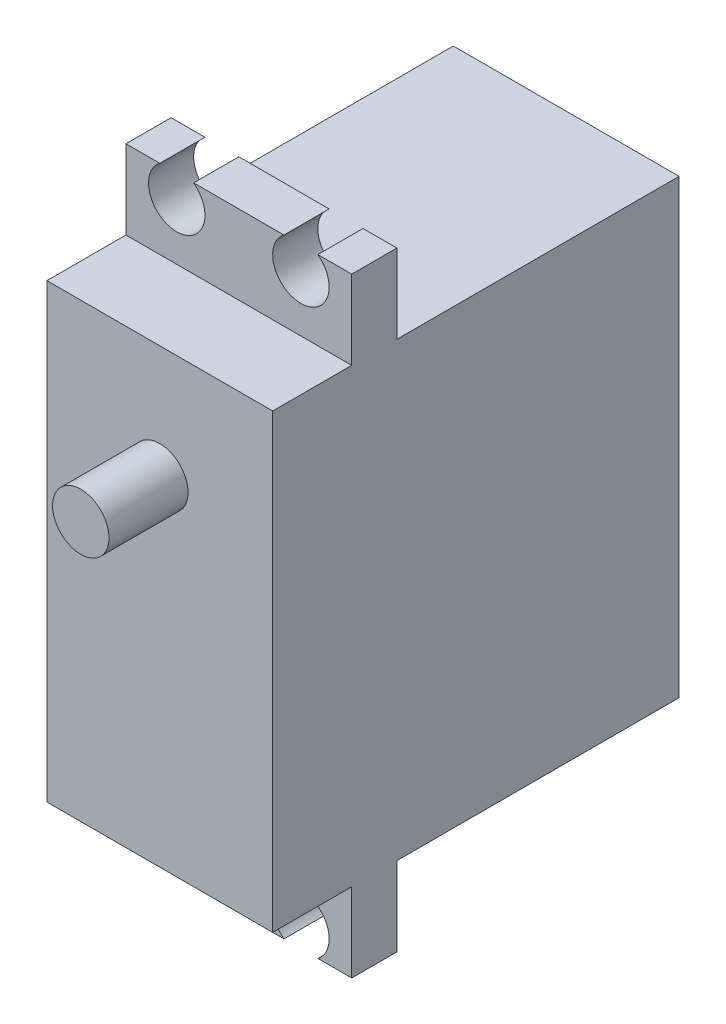
ISO-10303-21;
HEADER;
FILE_DESCRIPTION(('STEP AP214'),'2;1');
FILE_NAME('part.step','',(''),(''),'','','');
FILE_SCHEMA(('AUTOMOTIVE_DESIGN { 1 0 10303 214 1 1 1 1 }'));
ENDSEC;
DATA;
#1=APPLICATION_CONTEXT('core data for automotive mechanical design processes');
#2=APPLICATION_PROTOCOL_DEFINITION('international standard','automotive_design',2000,#1);
#3=PRODUCT_CONTEXT('',#1,'mechanical');
#4=PRODUCT('Part','Part','',(#3));
#5=PRODUCT_RELATED_PRODUCT_CATEGORY('part','',(#4));
#6=PRODUCT_DEFINITION_FORMATION('','',#4);
#7=PRODUCT_DEFINITION_CONTEXT('part definition',#1,'design');
#8=PRODUCT_DEFINITION('design','',#6,#7);
#9=PRODUCT_DEFINITION_SHAPE('','',#8);
#10=(LENGTH_UNIT() NAMED_UNIT(*) SI_UNIT(.MILLI.,.METRE.));
#11=(NAMED_UNIT(*) PLANE_ANGLE_UNIT() SI_UNIT($,.RADIAN.));
#12=(NAMED_UNIT(*) SI_UNIT($,.STERADIAN.) SOLID_ANGLE_UNIT());
#13=UNCERTAINTY_MEASURE_WITH_UNIT(LENGTH_MEASURE(1.E-05),#10,'distance_accuracy_value','');
#14=(GEOMETRIC_REPRESENTATION_CONTEXT(3) GLOBAL_UNCERTAINTY_ASSIGNED_CONTEXT((#13)) GLOBAL_UNIT_ASSIGNED_CONTEXT((#10,
#11,#12)) REPRESENTATION_CONTEXT('',''));
#15=CARTESIAN_POINT('',(0.,0.,0.));
#16=DIRECTION('',(0.,0.,1.));
#17=DIRECTION('',(1.,0.,0.));
#18=AXIS2_PLACEMENT_3D('',#15,#16,#17);
#19=CARTESIAN_POINT('',(0.,7.,25.));
#20=DIRECTION('',(0.,1.,0.));
#21=DIRECTION('',(0.,0.,1.));
#22=AXIS2_PLACEMENT_3D('',#19,#20,#21);
#23=PLANE('',#22);
#24=DIRECTION('',(0.,0.,1.));
#25=VECTOR('',#24,1.);
#26=CARTESIAN_POINT('',(14.,7.,22.));
#27=LINE('',#26,#25);
#28=CARTESIAN_POINT('',(14.,7.,25.));
#29=VERTEX_POINT('',#28);
#30=CARTESIAN_POINT('',(14.,7.,29.));
#31=VERTEX_POINT('',#30);
#32=EDGE_CURVE('E48',#29,#31,#27,.T.);
#33=ORIENTED_EDGE('',*,*,#32,.F.);
#34=DIRECTION('',(-1.,0.,0.));
#35=VECTOR('',#34,1.);
#36=CARTESIAN_POINT('',(0.,7.,25.));
#37=LINE('',#36,#35);
#38=CARTESIAN_POINT('',(6.,7.,25.));
#39=VERTEX_POINT('',#38);
#40=EDGE_CURVE('E237',#29,#39,#37,.T.);
#41=ORIENTED_EDGE('',*,*,#40,.T.);
#42=DIRECTION('',(0.,0.,1.));
#43=VECTOR('',#42,1.);
#44=CARTESIAN_POINT('',(6.,7.,22.));
#45=LINE('',#44,#43);
#46=CARTESIAN_POINT('',(6.,7.,29.));
#47=VERTEX_POINT('',#46);
#48=EDGE_CURVE('E227',#47,#39,#45,.F.);
#49=ORIENTED_EDGE('',*,*,#48,.F.);
#50=DIRECTION('',(-1.,0.,0.));
#51=VECTOR('',#50,1.);
#52=CARTESIAN_POINT('',(0.,7.,29.));
#53=LINE('',#52,#51);
#54=EDGE_CURVE('E190',#31,#47,#53,.T.);
#55=ORIENTED_EDGE('',*,*,#54,.F.);
#56=EDGE_LOOP('',(#33,#41,#49,#55));
#57=FACE_BOUND('',#56,.T.);
#58=ADVANCED_FACE('F34',(#57),#23,.T.);
#59=DIRECTION('',(0.,0.,1.));
#60=VECTOR('',#59,1.);
#61=CARTESIAN_POINT('',(3.,7.,22.));
#62=LINE('',#61,#60);
#63=CARTESIAN_POINT('',(3.,7.,25.));
#64=VERTEX_POINT('',#63);
#65=CARTESIAN_POINT('',(3.,7.,29.));
#66=VERTEX_POINT('',#65);
#67=EDGE_CURVE('E56',#64,#66,#62,.T.);
#68=ORIENTED_EDGE('',*,*,#67,.F.);
#69=CARTESIAN_POINT('',(0.,7.,25.));
#70=VERTEX_POINT('',#69);
#71=EDGE_CURVE('E241',#64,#70,#37,.T.);
#72=ORIENTED_EDGE('',*,*,#71,.T.);
#73=DIRECTION('',(0.,0.,1.));
#74=VECTOR('',#73,1.);
#75=CARTESIAN_POINT('',(0.,7.,25.));
#76=LINE('',#75,#74);
#77=CARTESIAN_POINT('',(0.,7.,29.));
#78=VERTEX_POINT('',#77);
#79=EDGE_CURVE('E249',#70,#78,#76,.T.);
#80=ORIENTED_EDGE('',*,*,#79,.T.);
#81=EDGE_CURVE('E192',#66,#78,#53,.T.);
#82=ORIENTED_EDGE('',*,*,#81,.F.);
#83=EDGE_LOOP('',(#68,#72,#80,#82));
#84=FACE_BOUND('',#83,.T.);
#85=ADVANCED_FACE('F407',(#84),#23,.T.);
#86=CARTESIAN_POINT('',(0.,-47.,25.));
#87=DIRECTION('',(0.,-1.,0.));
#88=DIRECTION('',(0.,0.,-1.));
#89=AXIS2_PLACEMENT_3D('',#86,#87,#88);
#90=PLANE('',#89);
#91=DIRECTION('',(0.,0.,1.));
#92=VECTOR('',#91,1.);
#93=CARTESIAN_POINT('',(17.,-47.,22.));
#94=LINE('',#93,#92);
#95=CARTESIAN_POINT('',(17.,-47.,25.));
#96=VERTEX_POINT('',#95);
#97=CARTESIAN_POINT('',(17.,-47.,29.));
#98=VERTEX_POINT('',#97);
#99=EDGE_CURVE('E219',#96,#98,#94,.T.);
#100=ORIENTED_EDGE('',*,*,#99,.F.);
#101=DIRECTION('',(1.,0.,0.));
#102=VECTOR('',#101,1.);
#103=CARTESIAN_POINT('',(0.,-47.,25.));
#104=LINE('',#103,#102);
#105=CARTESIAN_POINT('',(20.,-47.,25.));
#106=VERTEX_POINT('',#105);
#107=EDGE_CURVE('E336',#96,#106,#104,.T.);
#108=ORIENTED_EDGE('',*,*,#107,.T.);
#109=DIRECTION('',(0.,0.,1.));
#110=VECTOR('',#109,1.);
#111=CARTESIAN_POINT('',(20.,-47.,25.));
#112=LINE('',#111,#110);
#113=CARTESIAN_POINT('',(20.,-47.,29.));
#114=VERTEX_POINT('',#113);
#115=EDGE_CURVE('E292',#106,#114,#112,.T.);
#116=ORIENTED_EDGE('',*,*,#115,.T.);
#117=DIRECTION('',(1.,0.,0.));
#118=VECTOR('',#117,1.);
#119=CARTESIAN_POINT('',(0.,-47.,29.));
#120=LINE('',#119,#118);
#121=EDGE_CURVE('E356',#98,#114,#120,.T.);
#122=ORIENTED_EDGE('',*,*,#121,.F.);
#123=EDGE_LOOP('',(#100,#108,#116,#122));
#124=FACE_BOUND('',#123,.T.);
#125=ADVANCED_FACE('F378',(#124),#90,.T.);
#126=DIRECTION('',(0.,0.,1.));
#127=VECTOR('',#126,1.);
#128=CARTESIAN_POINT('',(14.,-47.,22.));
#129=LINE('',#128,#127);
#130=CARTESIAN_POINT('',(14.,-47.,29.));
#131=VERTEX_POINT('',#130);
#132=CARTESIAN_POINT('',(14.,-47.,25.));
#133=VERTEX_POINT('',#132);
#134=EDGE_CURVE('E221',#131,#133,#129,.F.);
#135=ORIENTED_EDGE('',*,*,#134,.F.);
#136=CARTESIAN_POINT('',(6.,-47.,29.));
#137=VERTEX_POINT('',#136);
#138=EDGE_CURVE('E355',#137,#131,#120,.T.);
#139=ORIENTED_EDGE('',*,*,#138,.F.);
#140=DIRECTION('',(0.,0.,1.));
#141=VECTOR('',#140,1.);
#142=CARTESIAN_POINT('',(6.,-47.,22.));
#143=LINE('',#142,#141);
#144=CARTESIAN_POINT('',(6.,-47.,25.));
#145=VERTEX_POINT('',#144);
#146=EDGE_CURVE('E210',#145,#137,#143,.T.);
#147=ORIENTED_EDGE('',*,*,#146,.F.);
#148=EDGE_CURVE('E335',#145,#133,#104,.T.);
#149=ORIENTED_EDGE('',*,*,#148,.T.);
#150=EDGE_LOOP('',(#135,#139,#147,#149));
#151=FACE_BOUND('',#150,.T.);
#152=ADVANCED_FACE('F388',(#151),#90,.T.);
#153=CARTESIAN_POINT('',(0.,-40.,36.));
#154=DIRECTION('',(0.,0.,1.));
#155=DIRECTION('',(1.,0.,0.));
#156=AXIS2_PLACEMENT_3D('',#153,#154,#155);
#157=PLANE('',#156);
#158=DIRECTION('',(1.,0.,0.));
#159=VECTOR('',#158,1.);
#160=CARTESIAN_POINT('',(0.,0.,36.));
#161=LINE('',#160,#159);
#162=CARTESIAN_POINT('',(0.,0.,36.));
#163=VERTEX_POINT('',#162);
#164=CARTESIAN_POINT('',(20.,0.,36.));
#165=VERTEX_POINT('',#164);
#166=EDGE_CURVE('E205',#163,#165,#161,.T.);
#167=ORIENTED_EDGE('',*,*,#166,.F.);
#168=DIRECTION('',(0.,-1.,0.));
#169=VECTOR('',#168,1.);
#170=CARTESIAN_POINT('',(0.,0.,36.));
#171=LINE('',#170,#169);
#172=CARTESIAN_POINT('',(0.,-40.,36.));
#173=VERTEX_POINT('',#172);
#174=EDGE_CURVE('E254',#163,#173,#171,.T.);
#175=ORIENTED_EDGE('',*,*,#174,.T.);
#176=DIRECTION('',(-1.,0.,0.));
#177=VECTOR('',#176,1.);
#178=CARTESIAN_POINT('',(0.,-40.,36.));
#179=LINE('',#178,#177);
#180=CARTESIAN_POINT('',(20.,-40.,36.));
#181=VERTEX_POINT('',#180);
#182=EDGE_CURVE('E347',#181,#173,#179,.T.);
#183=ORIENTED_EDGE('',*,*,#182,.F.);
#184=DIRECTION('',(0.,1.,0.));
#185=VECTOR('',#184,1.);
#186=CARTESIAN_POINT('',(20.,0.,36.));
#187=LINE('',#186,#185);
#188=EDGE_CURVE('E256',#181,#165,#187,.T.);
#189=ORIENTED_EDGE('',*,*,#188,.T.);
#190=EDGE_LOOP('',(#167,#175,#183,#189));
#191=FACE_BOUND('',#190,.T.);
#192=CARTESIAN_POINT('',(10.,-10.,36.));
#193=DIRECTION('',(0.,0.,1.));
#194=DIRECTION('',(1.,0.,0.));
#195=AXIS2_PLACEMENT_3D('',#192,#193,#194);
#196=CIRCLE('',#195,2.5);
#197=CARTESIAN_POINT('',(12.5,-10.,36.));
#198=VERTEX_POINT('',#197);
#199=EDGE_CURVE('E206',#198,#198,#196,.T.);
#200=ORIENTED_EDGE('',*,*,#199,.F.);
#201=EDGE_LOOP('',(#200));
#202=FACE_BOUND('',#201,.T.);
#203=ADVANCED_FACE('F369',(#191,#202),#157,.T.);
#204=DIRECTION('',(0.,0.,1.));
#205=VECTOR('',#204,1.);
#206=CARTESIAN_POINT('',(17.,7.,22.));
#207=LINE('',#206,#205);
#208=CARTESIAN_POINT('',(17.,7.,29.));
#209=VERTEX_POINT('',#208);
#210=CARTESIAN_POINT('',(17.,7.,25.));
#211=VERTEX_POINT('',#210);
#212=EDGE_CURVE('E170',#209,#211,#207,.F.);
#213=ORIENTED_EDGE('',*,*,#212,.F.);
#214=CARTESIAN_POINT('',(20.,7.,29.));
#215=VERTEX_POINT('',#214);
#216=EDGE_CURVE('E179',#215,#209,#53,.T.);
#217=ORIENTED_EDGE('',*,*,#216,.F.);
#218=DIRECTION('',(0.,0.,1.));
#219=VECTOR('',#218,1.);
#220=CARTESIAN_POINT('',(20.,7.,25.));
#221=LINE('',#220,#219);
#222=CARTESIAN_POINT('',(20.,7.,25.));
#223=VERTEX_POINT('',#222);
#224=EDGE_CURVE('E243',#223,#215,#221,.T.);
#225=ORIENTED_EDGE('',*,*,#224,.F.);
#226=EDGE_CURVE('E182',#223,#211,#37,.T.);
#227=ORIENTED_EDGE('',*,*,#226,.T.);
#228=EDGE_LOOP('',(#213,#217,#225,#227));
#229=FACE_BOUND('',#228,.T.);
#230=ADVANCED_FACE('F178',(#229),#23,.T.);
#231=CARTESIAN_POINT('',(0.,0.,36.));
#232=DIRECTION('',(1.,0.,0.));
#233=DIRECTION('',(0.,1.,0.));
#234=AXIS2_PLACEMENT_3D('',#231,#232,#233);
#235=PLANE('',#234);
#236=ORIENTED_EDGE('',*,*,#174,.F.);
#237=DIRECTION('',(0.,0.,1.));
#238=VECTOR('',#237,1.);
#239=CARTESIAN_POINT('',(0.,0.,29.));
#240=LINE('',#239,#238);
#241=CARTESIAN_POINT('',(0.,0.,29.));
#242=VERTEX_POINT('',#241);
#243=EDGE_CURVE('E189',#242,#163,#240,.T.);
#244=ORIENTED_EDGE('',*,*,#243,.F.);
#245=DIRECTION('',(0.,-1.,0.));
#246=VECTOR('',#245,1.);
#247=CARTESIAN_POINT('',(0.,7.,29.));
#248=LINE('',#247,#246);
#249=EDGE_CURVE('E201',#78,#242,#248,.T.);
#250=ORIENTED_EDGE('',*,*,#249,.F.);
#251=ORIENTED_EDGE('',*,*,#79,.F.);
#252=DIRECTION('',(0.,-1.,0.));
#253=VECTOR('',#252,1.);
#254=CARTESIAN_POINT('',(0.,0.,25.));
#255=LINE('',#254,#253);
#256=CARTESIAN_POINT('',(0.,0.,25.));
#257=VERTEX_POINT('',#256);
#258=EDGE_CURVE('E285',#70,#257,#255,.T.);
#259=ORIENTED_EDGE('',*,*,#258,.T.);
#260=DIRECTION('',(0.,0.,-1.));
#261=VECTOR('',#260,1.);
#262=CARTESIAN_POINT('',(0.,0.,36.));
#263=LINE('',#262,#261);
#264=CARTESIAN_POINT('',(0.,0.,0.));
#265=VERTEX_POINT('',#264);
#266=EDGE_CURVE('E260',#257,#265,#263,.T.);
#267=ORIENTED_EDGE('',*,*,#266,.T.);
#268=DIRECTION('',(0.,-1.,0.));
#269=VECTOR('',#268,1.);
#270=CARTESIAN_POINT('',(0.,0.,0.));
#271=LINE('',#270,#269);
#272=CARTESIAN_POINT('',(0.,-40.,0.));
#273=VERTEX_POINT('',#272);
#274=EDGE_CURVE('E252',#265,#273,#271,.T.);
#275=ORIENTED_EDGE('',*,*,#274,.T.);
#276=DIRECTION('',(0.,0.,-1.));
#277=VECTOR('',#276,1.);
#278=CARTESIAN_POINT('',(0.,-40.,36.));
#279=LINE('',#278,#277);
#280=CARTESIAN_POINT('',(0.,-40.,25.));
#281=VERTEX_POINT('',#280);
#282=EDGE_CURVE('E296',#281,#273,#279,.T.);
#283=ORIENTED_EDGE('',*,*,#282,.F.);
#284=DIRECTION('',(0.,-1.,0.));
#285=VECTOR('',#284,1.);
#286=CARTESIAN_POINT('',(0.,-40.,25.));
#287=LINE('',#286,#285);
#288=CARTESIAN_POINT('',(0.,-47.,25.));
#289=VERTEX_POINT('',#288);
#290=EDGE_CURVE('E306',#281,#289,#287,.T.);
#291=ORIENTED_EDGE('',*,*,#290,.T.);
#292=DIRECTION('',(0.,0.,1.));
#293=VECTOR('',#292,1.);
#294=CARTESIAN_POINT('',(0.,-47.,25.));
#295=LINE('',#294,#293);
#296=CARTESIAN_POINT('',(0.,-47.,29.));
#297=VERTEX_POINT('',#296);
#298=EDGE_CURVE('E304',#289,#297,#295,.T.);
#299=ORIENTED_EDGE('',*,*,#298,.T.);
#300=DIRECTION('',(0.,-1.,0.));
#301=VECTOR('',#300,1.);
#302=CARTESIAN_POINT('',(0.,-47.,29.));
#303=LINE('',#302,#301);
#304=CARTESIAN_POINT('',(0.,-40.,29.));
#305=VERTEX_POINT('',#304);
#306=EDGE_CURVE('E320',#305,#297,#303,.T.);
#307=ORIENTED_EDGE('',*,*,#306,.F.);
#308=DIRECTION('',(0.,0.,1.));
#309=VECTOR('',#308,1.);
#310=CARTESIAN_POINT('',(0.,-40.,29.));
#311=LINE('',#310,#309);
#312=EDGE_CURVE('E342',#305,#173,#311,.T.);
#313=ORIENTED_EDGE('',*,*,#312,.T.);
#314=EDGE_LOOP('',(#236,#244,#250,#251,#259,#267,#275,#283,#291,#299,#307,#313));
#315=FACE_BOUND('',#314,.T.);
#316=ADVANCED_FACE('F36',(#315),#235,.F.);
#317=CARTESIAN_POINT('',(0.,-40.,36.));
#318=DIRECTION('',(0.,1.,0.));
#319=DIRECTION('',(0.,0.,1.));
#320=AXIS2_PLACEMENT_3D('',#317,#318,#319);
#321=PLANE('',#320);
#322=DIRECTION('',(0.,0.,-1.));
#323=VECTOR('',#322,1.);
#324=CARTESIAN_POINT('',(20.,-40.,36.));
#325=LINE('',#324,#323);
#326=CARTESIAN_POINT('',(20.,-40.,25.));
#327=VERTEX_POINT('',#326);
#328=CARTESIAN_POINT('',(20.,-40.,0.));
#329=VERTEX_POINT('',#328);
#330=EDGE_CURVE('E281',#327,#329,#325,.T.);
#331=ORIENTED_EDGE('',*,*,#330,.F.);
#332=DIRECTION('',(-1.,0.,0.));
#333=VECTOR('',#332,1.);
#334=CARTESIAN_POINT('',(0.,-40.,25.));
#335=LINE('',#334,#333);
#336=EDGE_CURVE('E300',#327,#281,#335,.T.);
#337=ORIENTED_EDGE('',*,*,#336,.T.);
#338=ORIENTED_EDGE('',*,*,#282,.T.);
#339=DIRECTION('',(1.,0.,0.));
#340=VECTOR('',#339,1.);
#341=CARTESIAN_POINT('',(0.,-40.,0.));
#342=LINE('',#341,#340);
#343=EDGE_CURVE('E263',#273,#329,#342,.T.);
#344=ORIENTED_EDGE('',*,*,#343,.T.);
#345=EDGE_LOOP('',(#331,#337,#338,#344));
#346=FACE_BOUND('',#345,.T.);
#347=ADVANCED_FACE('F397',(#346),#321,.F.);
#348=CARTESIAN_POINT('',(20.,0.,36.));
#349=DIRECTION('',(-1.,0.,0.));
#350=DIRECTION('',(0.,-1.,0.));
#351=AXIS2_PLACEMENT_3D('',#348,#349,#350);
#352=PLANE('',#351);
#353=DIRECTION('',(0.,1.,0.));
#354=VECTOR('',#353,1.);
#355=CARTESIAN_POINT('',(20.,7.,29.));
#356=LINE('',#355,#354);
#357=CARTESIAN_POINT('',(20.,0.,29.));
#358=VERTEX_POINT('',#357);
#359=EDGE_CURVE('E188',#358,#215,#356,.T.);
#360=ORIENTED_EDGE('',*,*,#359,.F.);
#361=DIRECTION('',(0.,0.,1.));
#362=VECTOR('',#361,1.);
#363=CARTESIAN_POINT('',(20.,0.,29.));
#364=LINE('',#363,#362);
#365=EDGE_CURVE('E193',#358,#165,#364,.T.);
#366=ORIENTED_EDGE('',*,*,#365,.T.);
#367=ORIENTED_EDGE('',*,*,#188,.F.);
#368=DIRECTION('',(0.,0.,1.));
#369=VECTOR('',#368,1.);
#370=CARTESIAN_POINT('',(20.,-40.,29.));
#371=LINE('',#370,#369);
#372=CARTESIAN_POINT('',(20.,-40.,29.));
#373=VERTEX_POINT('',#372);
#374=EDGE_CURVE('E343',#373,#181,#371,.T.);
#375=ORIENTED_EDGE('',*,*,#374,.F.);
#376=DIRECTION('',(0.,1.,0.));
#377=VECTOR('',#376,1.);
#378=CARTESIAN_POINT('',(20.,-47.,29.));
#379=LINE('',#378,#377);
#380=EDGE_CURVE('E352',#114,#373,#379,.T.);
#381=ORIENTED_EDGE('',*,*,#380,.F.);
#382=ORIENTED_EDGE('',*,*,#115,.F.);
#383=DIRECTION('',(0.,1.,0.));
#384=VECTOR('',#383,1.);
#385=CARTESIAN_POINT('',(20.,-40.,25.));
#386=LINE('',#385,#384);
#387=EDGE_CURVE('E305',#106,#327,#386,.T.);
#388=ORIENTED_EDGE('',*,*,#387,.T.);
#389=ORIENTED_EDGE('',*,*,#330,.T.);
#390=DIRECTION('',(0.,1.,0.));
#391=VECTOR('',#390,1.);
#392=CARTESIAN_POINT('',(20.,0.,0.));
#393=LINE('',#392,#391);
#394=CARTESIAN_POINT('',(20.,0.,0.));
#395=VERTEX_POINT('',#394);
#396=EDGE_CURVE('E266',#329,#395,#393,.T.);
#397=ORIENTED_EDGE('',*,*,#396,.T.);
#398=DIRECTION('',(0.,0.,-1.));
#399=VECTOR('',#398,1.);
#400=CARTESIAN_POINT('',(20.,0.,36.));
#401=LINE('',#400,#399);
#402=CARTESIAN_POINT('',(20.,0.,25.));
#403=VERTEX_POINT('',#402);
#404=EDGE_CURVE('E278',#403,#395,#401,.T.);
#405=ORIENTED_EDGE('',*,*,#404,.F.);
#406=DIRECTION('',(0.,1.,0.));
#407=VECTOR('',#406,1.);
#408=CARTESIAN_POINT('',(20.,0.,25.));
#409=LINE('',#408,#407);
#410=EDGE_CURVE('E244',#403,#223,#409,.T.);
#411=ORIENTED_EDGE('',*,*,#410,.T.);
#412=ORIENTED_EDGE('',*,*,#224,.T.);
#413=EDGE_LOOP('',(#360,#366,#367,#375,#381,#382,#388,#389,#397,#405,#411,#412));
#414=FACE_BOUND('',#413,.T.);
#415=ADVANCED_FACE('F366',(#414),#352,.F.);
#416=CARTESIAN_POINT('',(0.,0.,36.));
#417=DIRECTION('',(0.,-1.,0.));
#418=DIRECTION('',(0.,0.,-1.));
#419=AXIS2_PLACEMENT_3D('',#416,#417,#418);
#420=PLANE('',#419);
#421=ORIENTED_EDGE('',*,*,#266,.F.);
#422=DIRECTION('',(1.,0.,0.));
#423=VECTOR('',#422,1.);
#424=CARTESIAN_POINT('',(0.,0.,25.));
#425=LINE('',#424,#423);
#426=EDGE_CURVE('E282',#257,#403,#425,.T.);
#427=ORIENTED_EDGE('',*,*,#426,.T.);
#428=ORIENTED_EDGE('',*,*,#404,.T.);
#429=DIRECTION('',(-1.,0.,0.));
#430=VECTOR('',#429,1.);
#431=CARTESIAN_POINT('',(0.,0.,0.));
#432=LINE('',#431,#430);
#433=EDGE_CURVE('E257',#395,#265,#432,.T.);
#434=ORIENTED_EDGE('',*,*,#433,.T.);
#435=EDGE_LOOP('',(#421,#427,#428,#434));
#436=FACE_BOUND('',#435,.T.);
#437=ADVANCED_FACE('F403',(#436),#420,.F.);
#438=CARTESIAN_POINT('',(0.,-40.,0.));
#439=DIRECTION('',(0.,0.,1.));
#440=DIRECTION('',(1.,0.,0.));
#441=AXIS2_PLACEMENT_3D('',#438,#439,#440);
#442=PLANE('',#441);
#443=ORIENTED_EDGE('',*,*,#274,.F.);
#444=ORIENTED_EDGE('',*,*,#433,.F.);
#445=ORIENTED_EDGE('',*,*,#396,.F.);
#446=ORIENTED_EDGE('',*,*,#343,.F.);
#447=EDGE_LOOP('',(#443,#444,#445,#446));
#448=FACE_BOUND('',#447,.T.);
#449=ADVANCED_FACE('F400',(#448),#442,.F.);
#450=CARTESIAN_POINT('',(0.,0.,25.));
#451=DIRECTION('',(0.,0.,-1.));
#452=DIRECTION('',(-1.,0.,0.));
#453=AXIS2_PLACEMENT_3D('',#450,#451,#452);
#454=PLANE('',#453);
#455=CARTESIAN_POINT('',(15.5,5.,25.));
#456=DIRECTION('',(0.,0.,-1.));
#457=DIRECTION('',(-1.,0.,0.));
#458=AXIS2_PLACEMENT_3D('',#455,#456,#457);
#459=CIRCLE('',#458,2.5);
#460=EDGE_CURVE('E183',#211,#29,#459,.T.);
#461=ORIENTED_EDGE('',*,*,#460,.F.);
#462=ORIENTED_EDGE('',*,*,#226,.F.);
#463=ORIENTED_EDGE('',*,*,#410,.F.);
#464=ORIENTED_EDGE('',*,*,#426,.F.);
#465=ORIENTED_EDGE('',*,*,#258,.F.);
#466=ORIENTED_EDGE('',*,*,#71,.F.);
#467=CARTESIAN_POINT('',(4.5,5.,25.));
#468=DIRECTION('',(0.,0.,-1.));
#469=DIRECTION('',(-1.,0.,0.));
#470=AXIS2_PLACEMENT_3D('',#467,#468,#469);
#471=CIRCLE('',#470,2.5);
#472=EDGE_CURVE('E230',#39,#64,#471,.T.);
#473=ORIENTED_EDGE('',*,*,#472,.F.);
#474=ORIENTED_EDGE('',*,*,#40,.F.);
#475=EDGE_LOOP('',(#461,#462,#463,#464,#465,#466,#473,#474));
#476=FACE_BOUND('',#475,.T.);
#477=ADVANCED_FACE('F239',(#476),#454,.T.);
#478=DIRECTION('',(0.,0.,1.));
#479=VECTOR('',#478,1.);
#480=CARTESIAN_POINT('',(3.,-47.,22.));
#481=LINE('',#480,#479);
#482=CARTESIAN_POINT('',(3.,-47.,29.));
#483=VERTEX_POINT('',#482);
#484=CARTESIAN_POINT('',(3.,-47.,25.));
#485=VERTEX_POINT('',#484);
#486=EDGE_CURVE('E214',#483,#485,#481,.F.);
#487=ORIENTED_EDGE('',*,*,#486,.F.);
#488=EDGE_CURVE('E329',#297,#483,#120,.T.);
#489=ORIENTED_EDGE('',*,*,#488,.F.);
#490=ORIENTED_EDGE('',*,*,#298,.F.);
#491=EDGE_CURVE('E311',#289,#485,#104,.T.);
#492=ORIENTED_EDGE('',*,*,#491,.T.);
#493=EDGE_LOOP('',(#487,#489,#490,#492));
#494=FACE_BOUND('',#493,.T.);
#495=ADVANCED_FACE('F327',(#494),#90,.T.);
#496=CARTESIAN_POINT('',(0.,0.,25.));
#497=DIRECTION('',(0.,0.,1.));
#498=DIRECTION('',(1.,0.,0.));
#499=AXIS2_PLACEMENT_3D('',#496,#497,#498);
#500=PLANE('',#499);
#501=ORIENTED_EDGE('',*,*,#107,.F.);
#502=CARTESIAN_POINT('',(15.5,-45.,25.));
#503=DIRECTION('',(0.,0.,1.));
#504=DIRECTION('',(1.,0.,0.));
#505=AXIS2_PLACEMENT_3D('',#502,#503,#504);
#506=CIRCLE('',#505,2.5);
#507=EDGE_CURVE('E223',#96,#133,#506,.T.);
#508=ORIENTED_EDGE('',*,*,#507,.T.);
#509=ORIENTED_EDGE('',*,*,#148,.F.);
#510=CARTESIAN_POINT('',(4.5,-45.,25.));
#511=DIRECTION('',(0.,0.,1.));
#512=DIRECTION('',(1.,0.,0.));
#513=AXIS2_PLACEMENT_3D('',#510,#511,#512);
#514=CIRCLE('',#513,2.5);
#515=EDGE_CURVE('E216',#145,#485,#514,.T.);
#516=ORIENTED_EDGE('',*,*,#515,.T.);
#517=ORIENTED_EDGE('',*,*,#491,.F.);
#518=ORIENTED_EDGE('',*,*,#290,.F.);
#519=ORIENTED_EDGE('',*,*,#336,.F.);
#520=ORIENTED_EDGE('',*,*,#387,.F.);
#521=EDGE_LOOP('',(#501,#508,#509,#516,#517,#518,#519,#520));
#522=FACE_BOUND('',#521,.T.);
#523=ADVANCED_FACE('F332',(#522),#500,.F.);
#524=CARTESIAN_POINT('',(0.,-40.,29.));
#525=DIRECTION('',(0.,1.,0.));
#526=DIRECTION('',(0.,0.,1.));
#527=AXIS2_PLACEMENT_3D('',#524,#525,#526);
#528=PLANE('',#527);
#529=ORIENTED_EDGE('',*,*,#182,.T.);
#530=ORIENTED_EDGE('',*,*,#312,.F.);
#531=DIRECTION('',(-1.,0.,0.));
#532=VECTOR('',#531,1.);
#533=CARTESIAN_POINT('',(0.,-40.,29.));
#534=LINE('',#533,#532);
#535=EDGE_CURVE('E345',#373,#305,#534,.T.);
#536=ORIENTED_EDGE('',*,*,#535,.F.);
#537=ORIENTED_EDGE('',*,*,#374,.T.);
#538=EDGE_LOOP('',(#529,#530,#536,#537));
#539=FACE_BOUND('',#538,.T.);
#540=ADVANCED_FACE('F372',(#539),#528,.F.);
#541=CARTESIAN_POINT('',(0.,0.,29.));
#542=DIRECTION('',(0.,0.,-1.));
#543=DIRECTION('',(-1.,0.,0.));
#544=AXIS2_PLACEMENT_3D('',#541,#542,#543);
#545=PLANE('',#544);
#546=ORIENTED_EDGE('',*,*,#138,.T.);
#547=CARTESIAN_POINT('',(15.5,-45.,29.));
#548=DIRECTION('',(0.,0.,-1.));
#549=DIRECTION('',(-1.,0.,0.));
#550=AXIS2_PLACEMENT_3D('',#547,#548,#549);
#551=CIRCLE('',#550,2.5);
#552=EDGE_CURVE('E384',#131,#98,#551,.T.);
#553=ORIENTED_EDGE('',*,*,#552,.T.);
#554=ORIENTED_EDGE('',*,*,#121,.T.);
#555=ORIENTED_EDGE('',*,*,#380,.T.);
#556=ORIENTED_EDGE('',*,*,#535,.T.);
#557=ORIENTED_EDGE('',*,*,#306,.T.);
#558=ORIENTED_EDGE('',*,*,#488,.T.);
#559=CARTESIAN_POINT('',(4.5,-45.,29.));
#560=DIRECTION('',(0.,0.,-1.));
#561=DIRECTION('',(-1.,0.,0.));
#562=AXIS2_PLACEMENT_3D('',#559,#560,#561);
#563=CIRCLE('',#562,2.5);
#564=EDGE_CURVE('E299',#483,#137,#563,.T.);
#565=ORIENTED_EDGE('',*,*,#564,.T.);
#566=EDGE_LOOP('',(#546,#553,#554,#555,#556,#557,#558,#565));
#567=FACE_BOUND('',#566,.T.);
#568=ADVANCED_FACE('F383',(#567),#545,.F.);
#569=CARTESIAN_POINT('',(0.,0.,29.));
#570=DIRECTION('',(0.,-1.,0.));
#571=DIRECTION('',(0.,0.,-1.));
#572=AXIS2_PLACEMENT_3D('',#569,#570,#571);
#573=PLANE('',#572);
#574=ORIENTED_EDGE('',*,*,#166,.T.);
#575=ORIENTED_EDGE('',*,*,#365,.F.);
#576=DIRECTION('',(1.,0.,0.));
#577=VECTOR('',#576,1.);
#578=CARTESIAN_POINT('',(0.,0.,29.));
#579=LINE('',#578,#577);
#580=EDGE_CURVE('E200',#242,#358,#579,.T.);
#581=ORIENTED_EDGE('',*,*,#580,.F.);
#582=ORIENTED_EDGE('',*,*,#243,.T.);
#583=EDGE_LOOP('',(#574,#575,#581,#582));
#584=FACE_BOUND('',#583,.T.);
#585=ADVANCED_FACE('F361',(#584),#573,.F.);
#586=CARTESIAN_POINT('',(0.,0.,29.));
#587=DIRECTION('',(0.,0.,1.));
#588=DIRECTION('',(1.,0.,0.));
#589=AXIS2_PLACEMENT_3D('',#586,#587,#588);
#590=PLANE('',#589);
#591=CARTESIAN_POINT('',(15.5,5.,29.));
#592=DIRECTION('',(0.,0.,1.));
#593=DIRECTION('',(1.,0.,0.));
#594=AXIS2_PLACEMENT_3D('',#591,#592,#593);
#595=CIRCLE('',#594,2.5);
#596=EDGE_CURVE('E11',#31,#209,#595,.T.);
#597=ORIENTED_EDGE('',*,*,#596,.F.);
#598=ORIENTED_EDGE('',*,*,#54,.T.);
#599=CARTESIAN_POINT('',(4.5,5.,29.));
#600=DIRECTION('',(0.,0.,1.));
#601=DIRECTION('',(1.,0.,0.));
#602=AXIS2_PLACEMENT_3D('',#599,#600,#601);
#603=CIRCLE('',#602,2.5);
#604=EDGE_CURVE('E42',#66,#47,#603,.T.);
#605=ORIENTED_EDGE('',*,*,#604,.F.);
#606=ORIENTED_EDGE('',*,*,#81,.T.);
#607=ORIENTED_EDGE('',*,*,#249,.T.);
#608=ORIENTED_EDGE('',*,*,#580,.T.);
#609=ORIENTED_EDGE('',*,*,#359,.T.);
#610=ORIENTED_EDGE('',*,*,#216,.T.);
#611=EDGE_LOOP('',(#597,#598,#605,#606,#607,#608,#609,#610));
#612=FACE_BOUND('',#611,.T.);
#613=ADVANCED_FACE('F185',(#612),#590,.T.);
#614=CARTESIAN_POINT('',(10.,-10.,43.));
#615=DIRECTION('',(0.,0.,-1.));
#616=DIRECTION('',(-1.,0.,0.));
#617=AXIS2_PLACEMENT_3D('',#614,#615,#616);
#618=CYLINDRICAL_SURFACE('',#617,2.5);
#619=CARTESIAN_POINT('',(10.,-10.,43.));
#620=DIRECTION('',(0.,0.,1.));
#621=DIRECTION('',(1.,0.,0.));
#622=AXIS2_PLACEMENT_3D('',#619,#620,#621);
#623=CIRCLE('',#622,2.5);
#624=CARTESIAN_POINT('',(12.5,-10.,43.));
#625=VERTEX_POINT('',#624);
#626=EDGE_CURVE('E209',#625,#625,#623,.T.);
#627=ORIENTED_EDGE('',*,*,#626,.F.);
#628=EDGE_LOOP('',(#627));
#629=FACE_BOUND('',#628,.T.);
#630=ORIENTED_EDGE('',*,*,#199,.T.);
#631=EDGE_LOOP('',(#630));
#632=FACE_BOUND('',#631,.T.);
#633=ADVANCED_FACE('F490',(#629,#632),#618,.T.);
#634=CARTESIAN_POINT('',(10.,-10.,43.));
#635=DIRECTION('',(0.,0.,1.));
#636=DIRECTION('',(1.,0.,0.));
#637=AXIS2_PLACEMENT_3D('',#634,#635,#636);
#638=PLANE('',#637);
#639=ORIENTED_EDGE('',*,*,#626,.T.);
#640=EDGE_LOOP('',(#639));
#641=FACE_BOUND('',#640,.T.);
#642=ADVANCED_FACE('F498',(#641),#638,.T.);
#643=CARTESIAN_POINT('',(4.5,-45.,22.));
#644=DIRECTION('',(0.,0.,1.));
#645=DIRECTION('',(1.,0.,0.));
#646=AXIS2_PLACEMENT_3D('',#643,#644,#645);
#647=CYLINDRICAL_SURFACE('',#646,2.5);
#648=ORIENTED_EDGE('',*,*,#146,.T.);
#649=ORIENTED_EDGE('',*,*,#564,.F.);
#650=ORIENTED_EDGE('',*,*,#486,.T.);
#651=ORIENTED_EDGE('',*,*,#515,.F.);
#652=EDGE_LOOP('',(#648,#649,#650,#651));
#653=FACE_BOUND('',#652,.T.);
#654=ADVANCED_FACE('F506',(#653),#647,.F.);
#655=CARTESIAN_POINT('',(15.5,-45.,22.));
#656=DIRECTION('',(0.,0.,1.));
#657=DIRECTION('',(1.,0.,0.));
#658=AXIS2_PLACEMENT_3D('',#655,#656,#657);
#659=CYLINDRICAL_SURFACE('',#658,2.5);
#660=ORIENTED_EDGE('',*,*,#99,.T.);
#661=ORIENTED_EDGE('',*,*,#552,.F.);
#662=ORIENTED_EDGE('',*,*,#134,.T.);
#663=ORIENTED_EDGE('',*,*,#507,.F.);
#664=EDGE_LOOP('',(#660,#661,#662,#663));
#665=FACE_BOUND('',#664,.T.);
#666=ADVANCED_FACE('F390',(#665),#659,.F.);
#667=CARTESIAN_POINT('',(4.5,5.,22.));
#668=DIRECTION('',(0.,0.,1.));
#669=DIRECTION('',(1.,0.,0.));
#670=AXIS2_PLACEMENT_3D('',#667,#668,#669);
#671=CYLINDRICAL_SURFACE('',#670,2.5);
#672=ORIENTED_EDGE('',*,*,#67,.T.);
#673=ORIENTED_EDGE('',*,*,#604,.T.);
#674=ORIENTED_EDGE('',*,*,#48,.T.);
#675=ORIENTED_EDGE('',*,*,#472,.T.);
#676=EDGE_LOOP('',(#672,#673,#674,#675));
#677=FACE_BOUND('',#676,.T.);
#678=ADVANCED_FACE('F521',(#677),#671,.F.);
#679=CARTESIAN_POINT('',(15.5,5.,22.));
#680=DIRECTION('',(0.,0.,1.));
#681=DIRECTION('',(1.,0.,0.));
#682=AXIS2_PLACEMENT_3D('',#679,#680,#681);
#683=CYLINDRICAL_SURFACE('',#682,2.5);
#684=ORIENTED_EDGE('',*,*,#32,.T.);
#685=ORIENTED_EDGE('',*,*,#596,.T.);
#686=ORIENTED_EDGE('',*,*,#212,.T.);
#687=ORIENTED_EDGE('',*,*,#460,.T.);
#688=EDGE_LOOP('',(#684,#685,#686,#687));
#689=FACE_BOUND('',#688,.T.);
#690=ADVANCED_FACE('F169',(#689),#683,.F.);
#691=CLOSED_SHELL('',(#58,#85,#125,#152,#203,#230,#316,#347,#415,#437,#449,#477,#495,#523,#540,
#568,#585,#613,#633,#642,#654,#666,#678,#690));
#692=MANIFOLD_SOLID_BREP('B2',#691);
#693=ADVANCED_BREP_SHAPE_REPRESENTATION('',(#18,#692),#14);
#694=SHAPE_DEFINITION_REPRESENTATION(#9,#693);
ENDSEC;
END-ISO-10303-21;
